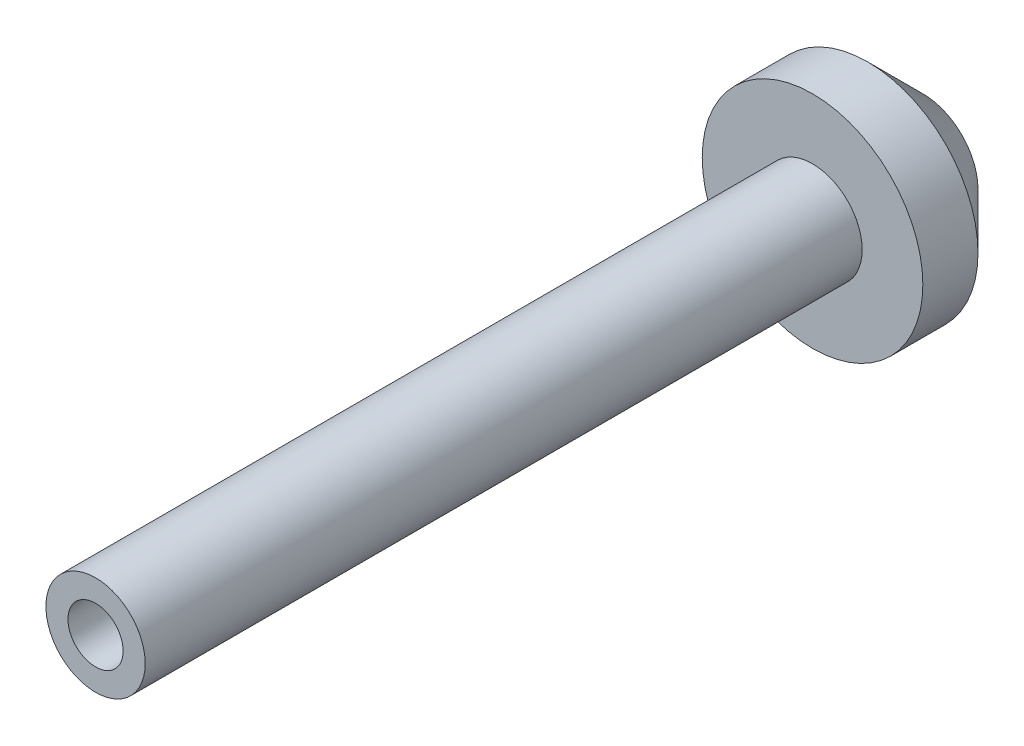
ISO-10303-21;
HEADER;
FILE_DESCRIPTION(('STEP AP214'),'2;1');
FILE_NAME('part.step','',(''),(''),'','','');
FILE_SCHEMA(('AUTOMOTIVE_DESIGN { 1 0 10303 214 1 1 1 1 }'));
ENDSEC;
DATA;
#1=APPLICATION_CONTEXT('core data for automotive mechanical design processes');
#2=APPLICATION_PROTOCOL_DEFINITION('international standard','automotive_design',2000,#1);
#3=PRODUCT_CONTEXT('',#1,'mechanical');
#4=PRODUCT('Part','Part','',(#3));
#5=PRODUCT_RELATED_PRODUCT_CATEGORY('part','',(#4));
#6=PRODUCT_DEFINITION_FORMATION('','',#4);
#7=PRODUCT_DEFINITION_CONTEXT('part definition',#1,'design');
#8=PRODUCT_DEFINITION('design','',#6,#7);
#9=PRODUCT_DEFINITION_SHAPE('','',#8);
#10=(LENGTH_UNIT() NAMED_UNIT(*) SI_UNIT(.MILLI.,.METRE.));
#11=(NAMED_UNIT(*) PLANE_ANGLE_UNIT() SI_UNIT($,.RADIAN.));
#12=(NAMED_UNIT(*) SI_UNIT($,.STERADIAN.) SOLID_ANGLE_UNIT());
#13=UNCERTAINTY_MEASURE_WITH_UNIT(LENGTH_MEASURE(1.E-05),#10,'distance_accuracy_value','');
#14=(GEOMETRIC_REPRESENTATION_CONTEXT(3) GLOBAL_UNCERTAINTY_ASSIGNED_CONTEXT((#13)) GLOBAL_UNIT_ASSIGNED_CONTEXT((#10,
#11,#12)) REPRESENTATION_CONTEXT('',''));
#15=CARTESIAN_POINT('',(0.,0.,0.));
#16=DIRECTION('',(0.,0.,1.));
#17=DIRECTION('',(1.,0.,0.));
#18=AXIS2_PLACEMENT_3D('',#15,#16,#17);
#19=CARTESIAN_POINT('',(0.,0.,5.));
#20=DIRECTION('',(0.,0.,-1.));
#21=DIRECTION('',(-1.,0.,0.));
#22=AXIS2_PLACEMENT_3D('',#19,#20,#21);
#23=CYLINDRICAL_SURFACE('',#22,5.);
#24=CARTESIAN_POINT('',(0.,0.,2.5));
#25=DIRECTION('',(0.,0.,1.));
#26=DIRECTION('',(1.,0.,0.));
#27=AXIS2_PLACEMENT_3D('',#24,#25,#26);
#28=CIRCLE('',#27,5.);
#29=CARTESIAN_POINT('',(5.,0.,2.5));
#30=VERTEX_POINT('',#29);
#31=EDGE_CURVE('E40',#30,#30,#28,.T.);
#32=ORIENTED_EDGE('',*,*,#31,.T.);
#33=EDGE_LOOP('',(#32));
#34=FACE_BOUND('',#33,.T.);
#35=CARTESIAN_POINT('',(0.,0.,5.));
#36=DIRECTION('',(0.,0.,1.));
#37=DIRECTION('',(1.,0.,0.));
#38=AXIS2_PLACEMENT_3D('',#35,#36,#37);
#39=CIRCLE('',#38,5.);
#40=CARTESIAN_POINT('',(5.,0.,5.));
#41=VERTEX_POINT('',#40);
#42=EDGE_CURVE('E48',#41,#41,#39,.T.);
#43=ORIENTED_EDGE('',*,*,#42,.F.);
#44=EDGE_LOOP('',(#43));
#45=FACE_BOUND('',#44,.T.);
#46=ADVANCED_FACE('F32',(#34,#45),#23,.T.);
#47=CARTESIAN_POINT('',(0.,0.,5.));
#48=DIRECTION('',(0.,0.,1.));
#49=DIRECTION('',(1.,0.,0.));
#50=AXIS2_PLACEMENT_3D('',#47,#48,#49);
#51=PLANE('',#50);
#52=CARTESIAN_POINT('',(0.,0.,5.));
#53=DIRECTION('',(0.,0.,1.));
#54=DIRECTION('',(1.,0.,0.));
#55=AXIS2_PLACEMENT_3D('',#52,#53,#54);
#56=CIRCLE('',#55,2.25);
#57=CARTESIAN_POINT('',(2.25,0.,5.));
#58=VERTEX_POINT('',#57);
#59=EDGE_CURVE('E44',#58,#58,#56,.T.);
#60=ORIENTED_EDGE('',*,*,#59,.F.);
#61=EDGE_LOOP('',(#60));
#62=FACE_BOUND('',#61,.T.);
#63=ORIENTED_EDGE('',*,*,#42,.T.);
#64=EDGE_LOOP('',(#63));
#65=FACE_BOUND('',#64,.T.);
#66=ADVANCED_FACE('F84',(#62,#65),#51,.T.);
#67=CARTESIAN_POINT('',(0.,0.,0.));
#68=DIRECTION('',(0.,0.,1.));
#69=DIRECTION('',(1.,0.,0.));
#70=AXIS2_PLACEMENT_3D('',#67,#68,#69);
#71=PLANE('',#70);
#72=CARTESIAN_POINT('',(0.,0.,0.));
#73=DIRECTION('',(0.,0.,1.));
#74=DIRECTION('',(1.,0.,0.));
#75=AXIS2_PLACEMENT_3D('',#72,#73,#74);
#76=CIRCLE('',#75,2.49999999999999);
#77=CARTESIAN_POINT('',(2.49999999999998,0.,0.));
#78=VERTEX_POINT('',#77);
#79=EDGE_CURVE('E10',#78,#78,#76,.F.);
#80=ORIENTED_EDGE('',*,*,#79,.T.);
#81=EDGE_LOOP('',(#80));
#82=FACE_BOUND('',#81,.T.);
#83=ADVANCED_FACE('F80',(#82),#71,.F.);
#84=CARTESIAN_POINT('',(0.,0.,37.5));
#85=DIRECTION('',(0.,0.,-1.));
#86=DIRECTION('',(-1.,0.,0.));
#87=AXIS2_PLACEMENT_3D('',#84,#85,#86);
#88=CYLINDRICAL_SURFACE('',#87,2.25);
#89=CARTESIAN_POINT('',(0.,0.,37.5));
#90=DIRECTION('',(0.,0.,1.));
#91=DIRECTION('',(1.,0.,0.));
#92=AXIS2_PLACEMENT_3D('',#89,#90,#91);
#93=CIRCLE('',#92,2.25);
#94=CARTESIAN_POINT('',(2.25,0.,37.5));
#95=VERTEX_POINT('',#94);
#96=EDGE_CURVE('E52',#95,#95,#93,.T.);
#97=ORIENTED_EDGE('',*,*,#96,.F.);
#98=EDGE_LOOP('',(#97));
#99=FACE_BOUND('',#98,.T.);
#100=ORIENTED_EDGE('',*,*,#59,.T.);
#101=EDGE_LOOP('',(#100));
#102=FACE_BOUND('',#101,.T.);
#103=ADVANCED_FACE('F74',(#99,#102),#88,.T.);
#104=CARTESIAN_POINT('',(0.,0.,37.5));
#105=DIRECTION('',(0.,0.,1.));
#106=DIRECTION('',(1.,0.,0.));
#107=AXIS2_PLACEMENT_3D('',#104,#105,#106);
#108=PLANE('',#107);
#109=CARTESIAN_POINT('',(0.,0.,37.5));
#110=DIRECTION('',(0.,0.,1.));
#111=DIRECTION('',(1.,0.,0.));
#112=AXIS2_PLACEMENT_3D('',#109,#110,#111);
#113=CIRCLE('',#112,1.25);
#114=CARTESIAN_POINT('',(1.25,0.,37.5));
#115=VERTEX_POINT('',#114);
#116=EDGE_CURVE('E57',#115,#115,#113,.T.);
#117=ORIENTED_EDGE('',*,*,#116,.F.);
#118=EDGE_LOOP('',(#117));
#119=FACE_BOUND('',#118,.T.);
#120=ORIENTED_EDGE('',*,*,#96,.T.);
#121=EDGE_LOOP('',(#120));
#122=FACE_BOUND('',#121,.T.);
#123=ADVANCED_FACE('F68',(#119,#122),#108,.T.);
#124=CARTESIAN_POINT('',(0.,0.,27.5));
#125=DIRECTION('',(0.,0.,1.));
#126=DIRECTION('',(1.,0.,0.));
#127=AXIS2_PLACEMENT_3D('',#124,#125,#126);
#128=CYLINDRICAL_SURFACE('',#127,1.25);
#129=CARTESIAN_POINT('',(0.,0.,27.5));
#130=DIRECTION('',(0.,0.,1.));
#131=DIRECTION('',(1.,0.,0.));
#132=AXIS2_PLACEMENT_3D('',#129,#130,#131);
#133=CIRCLE('',#132,1.25);
#134=CARTESIAN_POINT('',(1.25,0.,27.5));
#135=VERTEX_POINT('',#134);
#136=EDGE_CURVE('E56',#135,#135,#133,.T.);
#137=ORIENTED_EDGE('',*,*,#136,.F.);
#138=EDGE_LOOP('',(#137));
#139=FACE_BOUND('',#138,.T.);
#140=ORIENTED_EDGE('',*,*,#116,.T.);
#141=EDGE_LOOP('',(#140));
#142=FACE_BOUND('',#141,.T.);
#143=ADVANCED_FACE('F65',(#139,#142),#128,.F.);
#144=CARTESIAN_POINT('',(0.,0.,27.5));
#145=DIRECTION('',(0.,0.,1.));
#146=DIRECTION('',(1.,0.,0.));
#147=AXIS2_PLACEMENT_3D('',#144,#145,#146);
#148=PLANE('',#147);
#149=ORIENTED_EDGE('',*,*,#136,.T.);
#150=EDGE_LOOP('',(#149));
#151=FACE_BOUND('',#150,.T.);
#152=ADVANCED_FACE('F63',(#151),#148,.T.);
#153=CARTESIAN_POINT('',(0.,0.,2.5));
#154=DIRECTION('',(0.,0.,1.));
#155=DIRECTION('',(1.,0.,0.));
#156=AXIS2_PLACEMENT_3D('',#153,#154,#155);
#157=CONICAL_SURFACE('',#156,5.,0.78539816339745);
#158=CARTESIAN_POINT('',(2.49999999999998,0.,0.));
#159=CARTESIAN_POINT('',(2.52604166666665,0.,0.0260416666666661));
#160=CARTESIAN_POINT('',(2.55208333333332,0.,0.0520833333333329));
#161=CARTESIAN_POINT('',(2.60416666666665,0.,0.104166666666666));
#162=CARTESIAN_POINT('',(2.63020833333332,0.,0.130208333333333));
#163=CARTESIAN_POINT('',(2.68229166666665,0.,0.182291666666667));
#164=CARTESIAN_POINT('',(2.70833333333332,0.,0.208333333333333));
#165=CARTESIAN_POINT('',(2.76041666666665,0.,0.260416666666667));
#166=CARTESIAN_POINT('',(2.78645833333332,0.,0.286458333333334));
#167=CARTESIAN_POINT('',(2.83854166666665,0.,0.338541666666667));
#168=CARTESIAN_POINT('',(2.86458333333332,0.,0.364583333333334));
#169=CARTESIAN_POINT('',(2.91666666666665,0.,0.416666666666667));
#170=CARTESIAN_POINT('',(2.94270833333332,0.,0.442708333333334));
#171=CARTESIAN_POINT('',(2.99479166666665,0.,0.494791666666667));
#172=CARTESIAN_POINT('',(3.02083333333332,0.,0.520833333333334));
#173=CARTESIAN_POINT('',(3.07291666666665,0.,0.572916666666668));
#174=CARTESIAN_POINT('',(3.09895833333332,0.,0.598958333333334));
#175=CARTESIAN_POINT('',(3.15104166666665,0.,0.651041666666668));
#176=CARTESIAN_POINT('',(3.17708333333332,0.,0.677083333333334));
#177=CARTESIAN_POINT('',(3.22916666666666,0.,0.729166666666667));
#178=CARTESIAN_POINT('',(3.25520833333332,0.,0.755208333333334));
#179=CARTESIAN_POINT('',(3.30729166666666,0.,0.807291666666668));
#180=CARTESIAN_POINT('',(3.33333333333332,0.,0.833333333333334));
#181=CARTESIAN_POINT('',(3.38541666666666,0.,0.885416666666668));
#182=CARTESIAN_POINT('',(3.41145833333332,0.,0.911458333333335));
#183=CARTESIAN_POINT('',(3.46354166666666,0.,0.963541666666668));
#184=CARTESIAN_POINT('',(3.48958333333332,0.,0.989583333333335));
#185=CARTESIAN_POINT('',(3.54166666666666,0.,1.04166666666667));
#186=CARTESIAN_POINT('',(3.56770833333332,0.,1.06770833333334));
#187=CARTESIAN_POINT('',(3.61979166666666,0.,1.11979166666667));
#188=CARTESIAN_POINT('',(3.64583333333333,0.,1.14583333333334));
#189=CARTESIAN_POINT('',(3.69791666666666,0.,1.19791666666667));
#190=CARTESIAN_POINT('',(3.72395833333333,0.,1.22395833333334));
#191=CARTESIAN_POINT('',(3.77604166666666,0.,1.27604166666667));
#192=CARTESIAN_POINT('',(3.80208333333333,0.,1.30208333333334));
#193=CARTESIAN_POINT('',(3.85416666666666,0.,1.35416666666667));
#194=CARTESIAN_POINT('',(3.88020833333333,0.,1.38020833333334));
#195=CARTESIAN_POINT('',(3.93229166666666,0.,1.43229166666667));
#196=CARTESIAN_POINT('',(3.95833333333333,0.,1.45833333333334));
#197=CARTESIAN_POINT('',(4.01041666666666,0.,1.51041666666667));
#198=CARTESIAN_POINT('',(4.03645833333333,0.,1.53645833333334));
#199=CARTESIAN_POINT('',(4.08854166666666,0.,1.58854166666667));
#200=CARTESIAN_POINT('',(4.11458333333333,0.,1.61458333333334));
#201=CARTESIAN_POINT('',(4.16666666666666,0.,1.66666666666667));
#202=CARTESIAN_POINT('',(4.19270833333333,0.,1.69270833333334));
#203=CARTESIAN_POINT('',(4.24479166666666,0.,1.74479166666667));
#204=CARTESIAN_POINT('',(4.27083333333333,0.,1.77083333333334));
#205=CARTESIAN_POINT('',(4.32291666666666,0.,1.82291666666667));
#206=CARTESIAN_POINT('',(4.34895833333333,0.,1.84895833333334));
#207=CARTESIAN_POINT('',(4.40104166666666,0.,1.90104166666667));
#208=CARTESIAN_POINT('',(4.42708333333333,0.,1.92708333333334));
#209=CARTESIAN_POINT('',(4.47916666666666,0.,1.97916666666667));
#210=CARTESIAN_POINT('',(4.50520833333333,0.,2.00520833333334));
#211=CARTESIAN_POINT('',(4.55729166666666,0.,2.05729166666667));
#212=CARTESIAN_POINT('',(4.58333333333333,0.,2.08333333333334));
#213=CARTESIAN_POINT('',(4.63541666666666,0.,2.13541666666667));
#214=CARTESIAN_POINT('',(4.66145833333333,0.,2.16145833333334));
#215=CARTESIAN_POINT('',(4.71354166666666,0.,2.21354166666667));
#216=CARTESIAN_POINT('',(4.73958333333333,0.,2.23958333333334));
#217=CARTESIAN_POINT('',(4.79166666666667,0.,2.29166666666667));
#218=CARTESIAN_POINT('',(4.81770833333333,0.,2.31770833333334));
#219=CARTESIAN_POINT('',(4.86979166666667,0.,2.36979166666667));
#220=CARTESIAN_POINT('',(4.89583333333333,0.,2.39583333333334));
#221=CARTESIAN_POINT('',(4.94791666666667,0.,2.44791666666667));
#222=CARTESIAN_POINT('',(4.97395833333333,0.,2.47395833333334));
#223=CARTESIAN_POINT('',(5.,0.,2.5));
#224=B_SPLINE_CURVE_WITH_KNOTS('',3,(#158,#159,#160,#161,#162,#163,#164,#165,#166,#167,#168,
#169,#170,#171,#172,#173,#174,#175,#176,#177,#178,#179,#180,#181,#182,#183,#184,#185,#186,#187,
#188,#189,#190,#191,#192,#193,#194,#195,#196,#197,#198,#199,#200,#201,#202,#203,#204,#205,#206,
#207,#208,#209,#210,#211,#212,#213,#214,#215,#216,#217,#218,#219,#220,#221,#222,#223),
.UNSPECIFIED.,.F.,.F.,(4,2,2,2,2,2,2,2,2,2,2,2,2,2,2,2,2,2,2,2,2,2,2,2,2,2,2,2,2,2,2,2,4),(0.,
0.110485434560398,0.220970869120797,0.331456303681196,0.441941738241594,0.552427172801993,
0.662912607362391,0.77339804192279,0.883883476483188,0.994368911043586,1.10485434560398,
1.21533978016438,1.32582521472478,1.43631064928518,1.54679608384558,1.65728151840598,
1.76776695296638,1.87825238752677,1.98873782208717,2.09922325664757,2.20970869120797,
2.32019412576837,2.43067956032877,2.54116499488917,2.65165042944956,2.76213586400996,
2.87262129857036,2.98310673313076,3.09359216769116,3.20407760225156,3.31456303681195,
3.42504847137235,3.53553390593275),.UNSPECIFIED.);
#225=EDGE_CURVE('BSEAM35',#78,#30,#224,.T.);
#226=ORIENTED_EDGE('',*,*,#79,.F.);
#227=ORIENTED_EDGE('',*,*,#31,.F.);
#228=ORIENTED_EDGE('',*,*,#225,.T.);
#229=ORIENTED_EDGE('',*,*,#225,.F.);
#230=EDGE_LOOP('',(#226,#228,#227,#229));
#231=FACE_BOUND('',#230,.T.);
#232=ADVANCED_FACE('F35',(#231),#157,.T.);
#233=CLOSED_SHELL('',(#46,#66,#83,#103,#123,#143,#152,#232));
#234=MANIFOLD_SOLID_BREP('B2',#233);
#235=ADVANCED_BREP_SHAPE_REPRESENTATION('',(#18,#234),#14);
#236=SHAPE_DEFINITION_REPRESENTATION(#9,#235);
ENDSEC;
END-ISO-10303-21;
